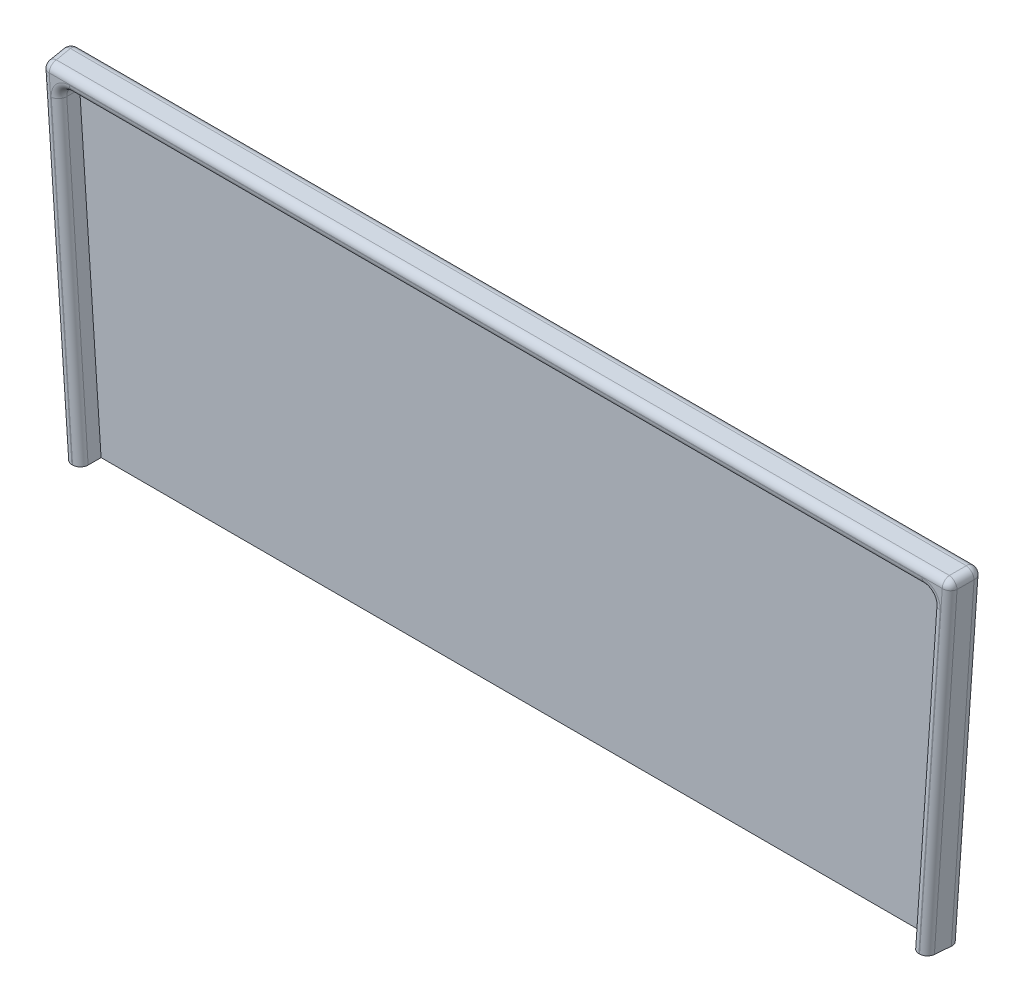
ISO-10303-21;
HEADER;
FILE_DESCRIPTION(('STEP AP214'),'2;1');
FILE_NAME('part.step','',(''),(''),'','','');
FILE_SCHEMA(('AUTOMOTIVE_DESIGN { 1 0 10303 214 1 1 1 1 }'));
ENDSEC;
DATA;
#1=APPLICATION_CONTEXT('core data for automotive mechanical design processes');
#2=APPLICATION_PROTOCOL_DEFINITION('international standard','automotive_design',2000,#1);
#3=PRODUCT_CONTEXT('',#1,'mechanical');
#4=PRODUCT('Part','Part','',(#3));
#5=PRODUCT_RELATED_PRODUCT_CATEGORY('part','',(#4));
#6=PRODUCT_DEFINITION_FORMATION('','',#4);
#7=PRODUCT_DEFINITION_CONTEXT('part definition',#1,'design');
#8=PRODUCT_DEFINITION('design','',#6,#7);
#9=PRODUCT_DEFINITION_SHAPE('','',#8);
#10=(LENGTH_UNIT() NAMED_UNIT(*) SI_UNIT(.MILLI.,.METRE.));
#11=(NAMED_UNIT(*) PLANE_ANGLE_UNIT() SI_UNIT($,.RADIAN.));
#12=(NAMED_UNIT(*) SI_UNIT($,.STERADIAN.) SOLID_ANGLE_UNIT());
#13=UNCERTAINTY_MEASURE_WITH_UNIT(LENGTH_MEASURE(1.E-05),#10,'distance_accuracy_value','');
#14=(GEOMETRIC_REPRESENTATION_CONTEXT(3) GLOBAL_UNCERTAINTY_ASSIGNED_CONTEXT((#13)) GLOBAL_UNIT_ASSIGNED_CONTEXT((#10,
#11,#12)) REPRESENTATION_CONTEXT('',''));
#15=CARTESIAN_POINT('',(0.,0.,0.));
#16=DIRECTION('',(0.,0.,1.));
#17=DIRECTION('',(1.,0.,0.));
#18=AXIS2_PLACEMENT_3D('',#15,#16,#17);
#19=CARTESIAN_POINT('',(-44.107162435431,32.6,0.));
#20=DIRECTION('',(0.,0.996194698091745,0.0871557427476584));
#21=DIRECTION('',(0.,-0.0871557427476584,0.996194698091746));
#22=AXIS2_PLACEMENT_3D('',#19,#20,#21);
#23=PLANE('',#22);
#24=DIRECTION('',(-0.092993495569234,-0.0867780721809915,0.991877903761529));
#25=VECTOR('',#24,1.);
#26=CARTESIAN_POINT('',(42.5505675232624,31.894589532194,8.06287854193786));
#27=LINE('',#26,#25);
#28=CARTESIAN_POINT('',(43.0894253857317,32.397431652478,2.31536680706074));
#29=VERTEX_POINT('',#28);
#30=CARTESIAN_POINT('',(43.2300578595723,32.5286646477669,0.815366807060742));
#31=VERTEX_POINT('',#30);
#32=EDGE_CURVE('E236',#29,#31,#27,.F.);
#33=ORIENTED_EDGE('',*,*,#32,.T.);
#34=DIRECTION('',(-1.,0.,0.));
#35=VECTOR('',#34,1.);
#36=CARTESIAN_POINT('',(-43.3065025603487,32.5286646477669,0.815366807060744));
#37=LINE('',#36,#35);
#38=CARTESIAN_POINT('',(-43.2300578595724,32.5286646477669,0.815366807060743));
#39=VERTEX_POINT('',#38);
#40=EDGE_CURVE('E71',#31,#39,#37,.T.);
#41=ORIENTED_EDGE('',*,*,#40,.T.);
#42=DIRECTION('',(0.0929934955692342,-0.0867780721809915,0.991877903761529));
#43=VECTOR('',#42,1.);
#44=CARTESIAN_POINT('',(-43.3134264989845,32.6064611620742,-0.0738514204444272));
#45=LINE('',#44,#43);
#46=CARTESIAN_POINT('',(-43.0894253857317,32.397431652478,2.31536680706074));
#47=VERTEX_POINT('',#46);
#48=EDGE_CURVE('E239',#39,#47,#45,.T.);
#49=ORIENTED_EDGE('',*,*,#48,.T.);
#50=DIRECTION('',(-1.,0.,0.));
#51=VECTOR('',#50,1.);
#52=CARTESIAN_POINT('',(-44.107162435431,32.397431652478,2.31536680706074));
#53=LINE('',#52,#51);
#54=EDGE_CURVE('E339',#47,#29,#53,.F.);
#55=ORIENTED_EDGE('',*,*,#54,.T.);
#56=EDGE_LOOP('',(#33,#41,#49,#55));
#57=FACE_BOUND('',#56,.T.);
#58=ADVANCED_FACE('F46',(#57),#23,.T.);
#59=CARTESIAN_POINT('',(-41.849761213049,-0.00690654551877314,0.));
#60=DIRECTION('',(-0.993815915145607,-0.0688026402793116,0.0871557427476584));
#61=DIRECTION('',(0.0873627671195146,0.,0.996176564129683));
#62=AXIS2_PLACEMENT_3D('',#59,#60,#61);
#63=PLANE('',#62);
#64=DIRECTION('',(0.0929934955692342,-0.0867780721809915,0.991877903761529));
#65=VECTOR('',#64,1.);
#66=CARTESIAN_POINT('',(-43.7761358102887,31.5439522387925,2.94094968490362));
#67=LINE('',#66,#65);
#68=CARTESIAN_POINT('',(-43.834787322091,31.5986836486997,2.31536680706074));
#69=VERTEX_POINT('',#68);
#70=CARTESIAN_POINT('',(-43.9754197959316,31.7299166439886,0.815366807060745));
#71=VERTEX_POINT('',#70);
#72=EDGE_CURVE('E233',#69,#71,#67,.F.);
#73=ORIENTED_EDGE('',*,*,#72,.T.);
#74=DIRECTION('',(0.069065455187732,-0.997612130489456,0.));
#75=VECTOR('',#74,1.);
#76=CARTESIAN_POINT('',(-41.7790743457874,0.00492680857295884,0.815366807060744));
#77=LINE('',#76,#75);
#78=CARTESIAN_POINT('',(-41.7787332590401,0.,0.815366807060743));
#79=VERTEX_POINT('',#78);
#80=EDGE_CURVE('E11',#71,#79,#77,.T.);
#81=ORIENTED_EDGE('',*,*,#80,.T.);
#82=DIRECTION('',(-0.0873627671195146,0.,-0.996176564129683));
#83=VECTOR('',#82,1.);
#84=CARTESIAN_POINT('',(-41.8502357091808,0.,4.16123973979527E-05));
#85=LINE('',#84,#83);
#86=CARTESIAN_POINT('',(-41.6471861464117,0.,2.31536680706074));
#87=VERTEX_POINT('',#86);
#88=EDGE_CURVE('E227',#79,#87,#85,.F.);
#89=ORIENTED_EDGE('',*,*,#88,.T.);
#90=DIRECTION('',(0.069065455187732,-0.997612130489456,0.));
#91=VECTOR('',#90,1.);
#92=CARTESIAN_POINT('',(-41.6476765723078,0.0070839296094626,2.31536680706074));
#93=LINE('',#92,#91);
#94=EDGE_CURVE('E346',#87,#69,#93,.F.);
#95=ORIENTED_EDGE('',*,*,#94,.T.);
#96=EDGE_LOOP('',(#73,#81,#89,#95));
#97=FACE_BOUND('',#96,.T.);
#98=ADVANCED_FACE('F412',(#97),#63,.T.);
#99=CARTESIAN_POINT('',(44.1071624354309,32.6,0.));
#100=DIRECTION('',(0.993815915145607,-0.0688026402793107,0.0871557427476584));
#101=DIRECTION('',(0.0873627671195146,0.,-0.996176564129683));
#102=AXIS2_PLACEMENT_3D('',#99,#100,#101);
#103=PLANE('',#102);
#104=DIRECTION('',(-0.0873627671195146,0.,0.996176564129683));
#105=VECTOR('',#104,1.);
#106=CARTESIAN_POINT('',(41.8674647666103,0.,-0.196417174329174));
#107=LINE('',#106,#105);
#108=CARTESIAN_POINT('',(41.6471861464117,0.,2.31536680706074));
#109=VERTEX_POINT('',#108);
#110=CARTESIAN_POINT('',(41.77873325904,0.,0.815366807060744));
#111=VERTEX_POINT('',#110);
#112=EDGE_CURVE('E223',#109,#111,#107,.F.);
#113=ORIENTED_EDGE('',*,*,#112,.T.);
#114=DIRECTION('',(0.069065455187731,0.997612130489456,0.));
#115=VECTOR('',#114,1.);
#116=CARTESIAN_POINT('',(43.9806994839873,31.8061788047947,0.815366807060743));
#117=LINE('',#116,#115);
#118=CARTESIAN_POINT('',(43.9754197959315,31.7299166439886,0.815366807060743));
#119=VERTEX_POINT('',#118);
#120=EDGE_CURVE('E349',#111,#119,#117,.T.);
#121=ORIENTED_EDGE('',*,*,#120,.T.);
#122=DIRECTION('',(-0.0929934955692341,-0.0867780721809915,0.991877903761529));
#123=VECTOR('',#122,1.);
#124=CARTESIAN_POINT('',(44.0587884353436,31.8077131582959,-0.0738514204444297));
#125=LINE('',#124,#123);
#126=CARTESIAN_POINT('',(43.8347873220908,31.5986836486997,2.31536680706075));
#127=VERTEX_POINT('',#126);
#128=EDGE_CURVE('E242',#119,#127,#125,.T.);
#129=ORIENTED_EDGE('',*,*,#128,.T.);
#130=DIRECTION('',(0.069065455187731,0.997612130489456,0.));
#131=VECTOR('',#130,1.);
#132=CARTESIAN_POINT('',(43.9050777946897,32.6139904751282,2.31536680706074));
#133=LINE('',#132,#131);
#134=EDGE_CURVE('E325',#127,#109,#133,.F.);
#135=ORIENTED_EDGE('',*,*,#134,.T.);
#136=EDGE_LOOP('',(#113,#121,#129,#135));
#137=FACE_BOUND('',#136,.T.);
#138=ADVANCED_FACE('F444',(#137),#103,.T.);
#139=CARTESIAN_POINT('',(0.,0.,3.));
#140=DIRECTION('',(0.,0.,-1.));
#141=DIRECTION('',(-1.,0.,0.));
#142=AXIS2_PLACEMENT_3D('',#139,#140,#141);
#143=PLANE('',#142);
#144=DIRECTION('',(1.,0.,0.));
#145=VECTOR('',#144,1.);
#146=CARTESIAN_POINT('',(0.,0.,3.));
#147=LINE('',#146,#145);
#148=CARTESIAN_POINT('',(40.8353499444417,0.,3.));
#149=VERTEX_POINT('',#148);
#150=CARTESIAN_POINT('',(40.8982517652687,0.,3.));
#151=VERTEX_POINT('',#150);
#152=EDGE_CURVE('E212',#149,#151,#147,.T.);
#153=ORIENTED_EDGE('',*,*,#152,.T.);
#154=DIRECTION('',(-0.069065455187731,-0.997612130489456,0.));
#155=VECTOR('',#154,1.);
#156=CARTESIAN_POINT('',(40.7031655870114,-2.81791146371615,3.));
#157=LINE('',#156,#155);
#158=CARTESIAN_POINT('',(43.0894253857317,31.6502856289092,3.));
#159=VERTEX_POINT('',#158);
#160=EDGE_CURVE('E321',#151,#159,#157,.F.);
#161=ORIENTED_EDGE('',*,*,#160,.T.);
#162=DIRECTION('',(1.,0.,0.));
#163=VECTOR('',#162,1.);
#164=CARTESIAN_POINT('',(0.,31.6502856289092,3.));
#165=LINE('',#164,#163);
#166=CARTESIAN_POINT('',(-43.0894253857317,31.6502856289092,3.));
#167=VERTEX_POINT('',#166);
#168=EDGE_CURVE('E318',#159,#167,#165,.F.);
#169=ORIENTED_EDGE('',*,*,#168,.T.);
#170=DIRECTION('',(-0.069065455187732,0.997612130489456,0.));
#171=VECTOR('',#170,1.);
#172=CARTESIAN_POINT('',(-40.7031655870115,-2.8179114637162,3.));
#173=LINE('',#172,#171);
#174=CARTESIAN_POINT('',(-40.8982517652688,0.,3.));
#175=VERTEX_POINT('',#174);
#176=EDGE_CURVE('E300',#167,#175,#173,.F.);
#177=ORIENTED_EDGE('',*,*,#176,.T.);
#178=CARTESIAN_POINT('',(-40.8353499444417,0.,3.));
#179=VERTEX_POINT('',#178);
#180=EDGE_CURVE('E217',#175,#179,#147,.T.);
#181=ORIENTED_EDGE('',*,*,#180,.T.);
#182=DIRECTION('',(0.0690654551877322,-0.997612130489456,0.));
#183=VECTOR('',#182,1.);
#184=CARTESIAN_POINT('',(-40.6405638102035,-2.81357749455257,3.));
#185=LINE('',#184,#183);
#186=CARTESIAN_POINT('',(-42.8926578303309,29.7166694628437,3.));
#187=VERTEX_POINT('',#186);
#188=EDGE_CURVE('E273',#179,#187,#185,.F.);
#189=ORIENTED_EDGE('',*,*,#188,.T.);
#190=CARTESIAN_POINT('',(-41.1468366019744,29.8375340094222,3.));
#191=DIRECTION('',(0.,0.,-1.));
#192=DIRECTION('',(-1.,0.,0.));
#193=AXIS2_PLACEMENT_3D('',#190,#191,#192);
#194=CIRCLE('',#193,1.75);
#195=CARTESIAN_POINT('',(-41.1468366019744,31.5875340094222,3.));
#196=VERTEX_POINT('',#195);
#197=EDGE_CURVE('E270',#187,#196,#194,.T.);
#198=ORIENTED_EDGE('',*,*,#197,.T.);
#199=DIRECTION('',(-1.,0.,0.));
#200=VECTOR('',#199,1.);
#201=CARTESIAN_POINT('',(0.,31.5875340094222,3.));
#202=LINE('',#201,#200);
#203=CARTESIAN_POINT('',(41.1468366019743,31.5875340094222,3.));
#204=VERTEX_POINT('',#203);
#205=EDGE_CURVE('E267',#196,#204,#202,.F.);
#206=ORIENTED_EDGE('',*,*,#205,.T.);
#207=CARTESIAN_POINT('',(41.1468366019743,29.8375340094222,3.));
#208=DIRECTION('',(0.,0.,-1.));
#209=DIRECTION('',(-1.,0.,0.));
#210=AXIS2_PLACEMENT_3D('',#207,#208,#209);
#211=CIRCLE('',#210,1.75);
#212=CARTESIAN_POINT('',(42.8926578303308,29.7166694628437,3.));
#213=VERTEX_POINT('',#212);
#214=EDGE_CURVE('E276',#204,#213,#211,.T.);
#215=ORIENTED_EDGE('',*,*,#214,.T.);
#216=DIRECTION('',(0.0690654551877313,0.997612130489456,0.));
#217=VECTOR('',#216,1.);
#218=CARTESIAN_POINT('',(40.6405638102034,-2.81357749455253,3.));
#219=LINE('',#218,#217);
#220=EDGE_CURVE('E279',#213,#149,#219,.F.);
#221=ORIENTED_EDGE('',*,*,#220,.T.);
#222=EDGE_LOOP('',(#153,#161,#169,#177,#181,#189,#198,#206,#215,#221));
#223=FACE_BOUND('',#222,.T.);
#224=ADVANCED_FACE('F458',(#223),#143,.F.);
#225=CARTESIAN_POINT('',(0.,0.,0.));
#226=DIRECTION('',(0.,0.,-1.));
#227=DIRECTION('',(-1.,0.,0.));
#228=AXIS2_PLACEMENT_3D('',#225,#226,#227);
#229=PLANE('',#228);
#230=DIRECTION('',(1.,0.,0.));
#231=VECTOR('',#230,1.);
#232=CARTESIAN_POINT('',(43.3065025603486,31.781518624198,0.));
#233=LINE('',#232,#231);
#234=CARTESIAN_POINT('',(-43.2300578595724,31.7815186241981,0.));
#235=VERTEX_POINT('',#234);
#236=CARTESIAN_POINT('',(43.2300578595723,31.781518624198,0.));
#237=VERTEX_POINT('',#236);
#238=EDGE_CURVE('E370',#235,#237,#233,.T.);
#239=ORIENTED_EDGE('',*,*,#238,.T.);
#240=DIRECTION('',(-0.069065455187731,-0.997612130489456,0.));
#241=VECTOR('',#240,1.);
#242=CARTESIAN_POINT('',(41.0337124094281,0.0565287887824284,0.));
#243=LINE('',#242,#241);
#244=CARTESIAN_POINT('',(41.029798877897,0.,0.));
#245=VERTEX_POINT('',#244);
#246=EDGE_CURVE('E373',#237,#245,#243,.T.);
#247=ORIENTED_EDGE('',*,*,#246,.T.);
#248=DIRECTION('',(1.,0.,0.));
#249=VECTOR('',#248,1.);
#250=CARTESIAN_POINT('',(0.,0.,0.));
#251=LINE('',#250,#249);
#252=CARTESIAN_POINT('',(-41.0297988778971,0.,0.));
#253=VERTEX_POINT('',#252);
#254=EDGE_CURVE('E230',#253,#245,#251,.T.);
#255=ORIENTED_EDGE('',*,*,#254,.F.);
#256=DIRECTION('',(-0.069065455187732,0.997612130489456,0.));
#257=VECTOR('',#256,1.);
#258=CARTESIAN_POINT('',(-43.2353375476282,31.8577807850042,0.));
#259=LINE('',#258,#257);
#260=EDGE_CURVE('E367',#253,#235,#259,.T.);
#261=ORIENTED_EDGE('',*,*,#260,.T.);
#262=EDGE_LOOP('',(#239,#247,#255,#261));
#263=FACE_BOUND('',#262,.T.);
#264=ADVANCED_FACE('F451',(#263),#229,.T.);
#265=CARTESIAN_POINT('',(0.,0.,0.));
#266=DIRECTION('',(0.,1.,0.));
#267=DIRECTION('',(0.,0.,1.));
#268=AXIS2_PLACEMENT_3D('',#265,#266,#267);
#269=PLANE('',#268);
#270=ORIENTED_EDGE('',*,*,#254,.T.);
#271=CARTESIAN_POINT('',(41.029798877897,0.,0.75));
#272=DIRECTION('',(0.,1.,0.));
#273=DIRECTION('',(1.,0.,0.));
#274=AXIS2_PLACEMENT_3D('',#271,#272,#273);
#275=ELLIPSE('',#274,0.751795188809532,0.75);
#276=EDGE_CURVE('E379',#245,#111,#275,.F.);
#277=ORIENTED_EDGE('',*,*,#276,.T.);
#278=ORIENTED_EDGE('',*,*,#112,.F.);
#279=CARTESIAN_POINT('',(40.8982517652687,0.,2.25));
#280=DIRECTION('',(0.,1.,0.));
#281=DIRECTION('',(-1.,0.,0.));
#282=AXIS2_PLACEMENT_3D('',#279,#280,#281);
#283=ELLIPSE('',#282,0.751795188809532,0.75);
#284=EDGE_CURVE('E332',#109,#151,#283,.F.);
#285=ORIENTED_EDGE('',*,*,#284,.T.);
#286=ORIENTED_EDGE('',*,*,#152,.F.);
#287=CARTESIAN_POINT('',(40.8353499444417,0.,2.25));
#288=DIRECTION('',(0.,1.,0.));
#289=DIRECTION('',(1.,0.,0.));
#290=AXIS2_PLACEMENT_3D('',#287,#288,#289);
#291=ELLIPSE('',#290,0.751795188809532,0.75);
#292=CARTESIAN_POINT('',(40.0835547556321,0.,2.25));
#293=VERTEX_POINT('',#292);
#294=EDGE_CURVE('E210',#149,#293,#291,.F.);
#295=ORIENTED_EDGE('',*,*,#294,.T.);
#296=DIRECTION('',(0.,0.,1.));
#297=VECTOR('',#296,1.);
#298=CARTESIAN_POINT('',(40.0835547556321,0.,1.));
#299=LINE('',#298,#297);
#300=CARTESIAN_POINT('',(40.0835547556321,0.,1.));
#301=VERTEX_POINT('',#300);
#302=EDGE_CURVE('E185',#301,#293,#299,.T.);
#303=ORIENTED_EDGE('',*,*,#302,.F.);
#304=DIRECTION('',(1.,0.,0.));
#305=VECTOR('',#304,1.);
#306=CARTESIAN_POINT('',(-40.0835547556322,0.,1.));
#307=LINE('',#306,#305);
#308=CARTESIAN_POINT('',(-40.0835547556322,0.,1.));
#309=VERTEX_POINT('',#308);
#310=EDGE_CURVE('E196',#309,#301,#307,.T.);
#311=ORIENTED_EDGE('',*,*,#310,.F.);
#312=DIRECTION('',(0.,0.,1.));
#313=VECTOR('',#312,1.);
#314=CARTESIAN_POINT('',(-40.0835547556322,0.,1.));
#315=LINE('',#314,#313);
#316=CARTESIAN_POINT('',(-40.0835547556322,0.,2.25));
#317=VERTEX_POINT('',#316);
#318=EDGE_CURVE('E204',#309,#317,#315,.T.);
#319=ORIENTED_EDGE('',*,*,#318,.T.);
#320=CARTESIAN_POINT('',(-40.8353499444417,0.,2.25));
#321=DIRECTION('',(0.,1.,0.));
#322=DIRECTION('',(1.,0.,0.));
#323=AXIS2_PLACEMENT_3D('',#320,#321,#322);
#324=ELLIPSE('',#323,0.751795188809532,0.75);
#325=EDGE_CURVE('E282',#317,#179,#324,.F.);
#326=ORIENTED_EDGE('',*,*,#325,.T.);
#327=ORIENTED_EDGE('',*,*,#180,.F.);
#328=CARTESIAN_POINT('',(-40.8982517652688,0.,2.25));
#329=DIRECTION('',(0.,1.,0.));
#330=DIRECTION('',(-1.,0.,0.));
#331=AXIS2_PLACEMENT_3D('',#328,#329,#330);
#332=ELLIPSE('',#331,0.751795188809532,0.75);
#333=EDGE_CURVE('E328',#175,#87,#332,.F.);
#334=ORIENTED_EDGE('',*,*,#333,.T.);
#335=ORIENTED_EDGE('',*,*,#88,.F.);
#336=CARTESIAN_POINT('',(-41.0297988778971,0.,0.75));
#337=DIRECTION('',(0.,1.,0.));
#338=DIRECTION('',(1.,0.,0.));
#339=AXIS2_PLACEMENT_3D('',#336,#337,#338);
#340=ELLIPSE('',#339,0.751795188809532,0.75);
#341=EDGE_CURVE('E376',#79,#253,#340,.F.);
#342=ORIENTED_EDGE('',*,*,#341,.T.);
#343=EDGE_LOOP('',(#270,#277,#278,#285,#286,#295,#303,#311,#319,#326,#327,#334,#335,#342));
#344=FACE_BOUND('',#343,.T.);
#345=ADVANCED_FACE('F207',(#344),#269,.F.);
#346=CARTESIAN_POINT('',(40.0835547556321,0.,1.));
#347=DIRECTION('',(0.997612130489456,-0.0690654551877313,0.));
#348=DIRECTION('',(0.0690654551877313,0.997612130489456,0.));
#349=AXIS2_PLACEMENT_3D('',#346,#347,#348);
#350=PLANE('',#349);
#351=ORIENTED_EDGE('',*,*,#302,.T.);
#352=DIRECTION('',(0.0690654551877313,0.997612130489456,0.));
#353=VECTOR('',#352,1.);
#354=CARTESIAN_POINT('',(40.0835547556321,0.,2.25));
#355=LINE('',#354,#353);
#356=CARTESIAN_POINT('',(42.1444487324637,29.7684685542345,2.25));
#357=VERTEX_POINT('',#356);
#358=EDGE_CURVE('E264',#293,#357,#355,.T.);
#359=ORIENTED_EDGE('',*,*,#358,.T.);
#360=DIRECTION('',(0.,0.,1.));
#361=VECTOR('',#360,1.);
#362=CARTESIAN_POINT('',(42.1444487324637,29.7684685542345,1.));
#363=LINE('',#362,#361);
#364=CARTESIAN_POINT('',(42.1444487324637,29.7684685542345,1.));
#365=VERTEX_POINT('',#364);
#366=EDGE_CURVE('E188',#357,#365,#363,.F.);
#367=ORIENTED_EDGE('',*,*,#366,.T.);
#368=DIRECTION('',(0.0690654551877313,0.997612130489456,0.));
#369=VECTOR('',#368,1.);
#370=CARTESIAN_POINT('',(40.0835547556321,0.,1.));
#371=LINE('',#370,#369);
#372=EDGE_CURVE('E180',#301,#365,#371,.T.);
#373=ORIENTED_EDGE('',*,*,#372,.F.);
#374=EDGE_LOOP('',(#351,#359,#367,#373));
#375=FACE_BOUND('',#374,.T.);
#376=ADVANCED_FACE('F182',(#375),#350,.F.);
#377=CARTESIAN_POINT('',(-42.2184609562845,30.8375340094222,1.));
#378=DIRECTION('',(-0.997612130489456,-0.0690654551877322,0.));
#379=DIRECTION('',(0.0690654551877322,-0.997612130489456,0.));
#380=AXIS2_PLACEMENT_3D('',#377,#378,#379);
#381=PLANE('',#380);
#382=DIRECTION('',(0.,0.,1.));
#383=VECTOR('',#382,1.);
#384=CARTESIAN_POINT('',(-42.1444487324639,29.7684685542345,3.));
#385=LINE('',#384,#383);
#386=CARTESIAN_POINT('',(-42.1444487324639,29.7684685542345,1.));
#387=VERTEX_POINT('',#386);
#388=CARTESIAN_POINT('',(-42.1444487324639,29.7684685542345,2.25));
#389=VERTEX_POINT('',#388);
#390=EDGE_CURVE('E260',#387,#389,#385,.T.);
#391=ORIENTED_EDGE('',*,*,#390,.T.);
#392=DIRECTION('',(0.0690654551877322,-0.997612130489456,0.));
#393=VECTOR('',#392,1.);
#394=CARTESIAN_POINT('',(-42.2184609562845,30.8375340094222,2.25));
#395=LINE('',#394,#393);
#396=EDGE_CURVE('E291',#389,#317,#395,.T.);
#397=ORIENTED_EDGE('',*,*,#396,.T.);
#398=ORIENTED_EDGE('',*,*,#318,.F.);
#399=DIRECTION('',(0.0690654551877322,-0.997612130489456,0.));
#400=VECTOR('',#399,1.);
#401=CARTESIAN_POINT('',(-42.2184609562845,30.8375340094222,1.));
#402=LINE('',#401,#400);
#403=EDGE_CURVE('E199',#387,#309,#402,.T.);
#404=ORIENTED_EDGE('',*,*,#403,.F.);
#405=EDGE_LOOP('',(#391,#397,#398,#404));
#406=FACE_BOUND('',#405,.T.);
#407=ADVANCED_FACE('F497',(#406),#381,.F.);
#408=CARTESIAN_POINT('',(42.2184609562844,30.8375340094222,1.));
#409=DIRECTION('',(0.,1.,0.));
#410=DIRECTION('',(0.,0.,1.));
#411=AXIS2_PLACEMENT_3D('',#408,#409,#410);
#412=PLANE('',#411);
#413=DIRECTION('',(0.,0.,1.));
#414=VECTOR('',#413,1.);
#415=CARTESIAN_POINT('',(41.1468366019743,30.8375340094222,3.));
#416=LINE('',#415,#414);
#417=CARTESIAN_POINT('',(41.1468366019743,30.8375340094222,1.));
#418=VERTEX_POINT('',#417);
#419=CARTESIAN_POINT('',(41.1468366019743,30.8375340094222,2.25));
#420=VERTEX_POINT('',#419);
#421=EDGE_CURVE('E248',#418,#420,#416,.T.);
#422=ORIENTED_EDGE('',*,*,#421,.T.);
#423=DIRECTION('',(-1.,0.,0.));
#424=VECTOR('',#423,1.);
#425=CARTESIAN_POINT('',(42.2184609562844,30.8375340094222,2.25));
#426=LINE('',#425,#424);
#427=CARTESIAN_POINT('',(-41.1468366019744,30.8375340094222,2.25));
#428=VERTEX_POINT('',#427);
#429=EDGE_CURVE('E297',#420,#428,#426,.T.);
#430=ORIENTED_EDGE('',*,*,#429,.T.);
#431=DIRECTION('',(0.,0.,1.));
#432=VECTOR('',#431,1.);
#433=CARTESIAN_POINT('',(-41.1468366019744,30.8375340094222,1.));
#434=LINE('',#433,#432);
#435=CARTESIAN_POINT('',(-41.1468366019744,30.8375340094222,1.));
#436=VERTEX_POINT('',#435);
#437=EDGE_CURVE('E245',#428,#436,#434,.F.);
#438=ORIENTED_EDGE('',*,*,#437,.T.);
#439=DIRECTION('',(-1.,0.,0.));
#440=VECTOR('',#439,1.);
#441=CARTESIAN_POINT('',(42.2184609562844,30.8375340094222,1.));
#442=LINE('',#441,#440);
#443=EDGE_CURVE('E192',#418,#436,#442,.T.);
#444=ORIENTED_EDGE('',*,*,#443,.F.);
#445=EDGE_LOOP('',(#422,#430,#438,#444));
#446=FACE_BOUND('',#445,.T.);
#447=ADVANCED_FACE('F471',(#446),#412,.F.);
#448=CARTESIAN_POINT('',(0.,0.,1.));
#449=DIRECTION('',(0.,0.,1.));
#450=DIRECTION('',(1.,0.,0.));
#451=AXIS2_PLACEMENT_3D('',#448,#449,#450);
#452=PLANE('',#451);
#453=ORIENTED_EDGE('',*,*,#372,.T.);
#454=CARTESIAN_POINT('',(41.1468366019743,29.8375340094222,1.));
#455=DIRECTION('',(0.,0.,1.));
#456=DIRECTION('',(1.,0.,0.));
#457=AXIS2_PLACEMENT_3D('',#454,#455,#456);
#458=CIRCLE('',#457,1.);
#459=EDGE_CURVE('E257',#365,#418,#458,.T.);
#460=ORIENTED_EDGE('',*,*,#459,.T.);
#461=ORIENTED_EDGE('',*,*,#443,.T.);
#462=CARTESIAN_POINT('',(-41.1468366019744,29.8375340094222,1.));
#463=DIRECTION('',(0.,0.,1.));
#464=DIRECTION('',(1.,0.,0.));
#465=AXIS2_PLACEMENT_3D('',#462,#463,#464);
#466=CIRCLE('',#465,1.);
#467=EDGE_CURVE('E254',#436,#387,#466,.T.);
#468=ORIENTED_EDGE('',*,*,#467,.T.);
#469=ORIENTED_EDGE('',*,*,#403,.T.);
#470=ORIENTED_EDGE('',*,*,#310,.T.);
#471=EDGE_LOOP('',(#453,#460,#461,#468,#469,#470));
#472=FACE_BOUND('',#471,.T.);
#473=ADVANCED_FACE('F197',(#472),#452,.T.);
#474=CARTESIAN_POINT('',(-43.0307738739295,31.595554219002,2.87558287784288));
#475=DIRECTION('',(-0.0929934955692342,0.0867780721809915,-0.991877903761529));
#476=DIRECTION('',(-0.995633765023603,0.,0.0933456262763592));
#477=AXIS2_PLACEMENT_3D('',#474,#475,#476);
#478=CYLINDRICAL_SURFACE('',#477,0.75);
#479=ORIENTED_EDGE('',*,*,#48,.F.);
#480=CARTESIAN_POINT('',(-43.2300578595724,31.7815186241981,0.75));
#481=DIRECTION('',(-0.0929934955692342,0.0867780721809915,-0.991877903761529));
#482=DIRECTION('',(-0.995633765023603,0.,0.0933456262763592));
#483=AXIS2_PLACEMENT_3D('',#480,#481,#482);
#484=CIRCLE('',#483,0.75);
#485=EDGE_CURVE('E56',#39,#71,#484,.F.);
#486=ORIENTED_EDGE('',*,*,#485,.T.);
#487=ORIENTED_EDGE('',*,*,#72,.F.);
#488=CARTESIAN_POINT('',(-43.0894253857317,31.6502856289092,2.25));
#489=DIRECTION('',(-0.0929934955692342,0.0867780721809915,-0.991877903761529));
#490=DIRECTION('',(-0.995633765023603,0.,0.0933456262763592));
#491=AXIS2_PLACEMENT_3D('',#488,#489,#490);
#492=CIRCLE('',#491,0.75);
#493=EDGE_CURVE('E342',#69,#47,#492,.T.);
#494=ORIENTED_EDGE('',*,*,#493,.T.);
#495=EDGE_LOOP('',(#479,#486,#487,#494));
#496=FACE_BOUND('',#495,.T.);
#497=ADVANCED_FACE('F422',(#496),#478,.T.);
#498=CARTESIAN_POINT('',(42.5505675232624,31.1474435086252,7.99751173487712));
#499=DIRECTION('',(0.092993495569234,0.0867780721809914,-0.991877903761529));
#500=DIRECTION('',(-0.995633765023603,0.,-0.0933456262763591));
#501=AXIS2_PLACEMENT_3D('',#498,#499,#500);
#502=CYLINDRICAL_SURFACE('',#501,0.75);
#503=ORIENTED_EDGE('',*,*,#128,.F.);
#504=CARTESIAN_POINT('',(43.2300578595723,31.781518624198,0.749999999999999));
#505=DIRECTION('',(0.092993495569234,0.0867780721809914,-0.991877903761529));
#506=DIRECTION('',(-0.995633765023603,0.,-0.0933456262763591));
#507=AXIS2_PLACEMENT_3D('',#504,#505,#506);
#508=CIRCLE('',#507,0.75);
#509=EDGE_CURVE('E382',#119,#31,#508,.F.);
#510=ORIENTED_EDGE('',*,*,#509,.T.);
#511=ORIENTED_EDGE('',*,*,#32,.F.);
#512=CARTESIAN_POINT('',(43.0894253857317,31.6502856289092,2.25));
#513=DIRECTION('',(0.092993495569234,0.0867780721809914,-0.991877903761529));
#514=DIRECTION('',(-0.995633765023603,0.,-0.0933456262763591));
#515=AXIS2_PLACEMENT_3D('',#512,#513,#514);
#516=CIRCLE('',#515,0.75);
#517=EDGE_CURVE('E335',#29,#127,#516,.T.);
#518=ORIENTED_EDGE('',*,*,#517,.T.);
#519=EDGE_LOOP('',(#503,#510,#511,#518));
#520=FACE_BOUND('',#519,.T.);
#521=ADVANCED_FACE('F435',(#520),#502,.T.);
#522=CARTESIAN_POINT('',(41.1468366019743,29.8375340094222,1.));
#523=DIRECTION('',(0.,0.,-1.));
#524=DIRECTION('',(-1.,0.,0.));
#525=AXIS2_PLACEMENT_3D('',#522,#523,#524);
#526=CYLINDRICAL_SURFACE('',#525,1.);
#527=ORIENTED_EDGE('',*,*,#366,.F.);
#528=CARTESIAN_POINT('',(41.1468366019743,29.8375340094222,2.25));
#529=DIRECTION('',(0.,0.,-1.));
#530=DIRECTION('',(-1.,0.,0.));
#531=AXIS2_PLACEMENT_3D('',#528,#529,#530);
#532=CIRCLE('',#531,1.);
#533=EDGE_CURVE('E288',#357,#420,#532,.F.);
#534=ORIENTED_EDGE('',*,*,#533,.T.);
#535=ORIENTED_EDGE('',*,*,#421,.F.);
#536=ORIENTED_EDGE('',*,*,#459,.F.);
#537=EDGE_LOOP('',(#527,#534,#535,#536));
#538=FACE_BOUND('',#537,.T.);
#539=ADVANCED_FACE('F465',(#538),#526,.F.);
#540=CARTESIAN_POINT('',(-41.1468366019744,29.8375340094222,1.));
#541=DIRECTION('',(0.,0.,-1.));
#542=DIRECTION('',(-1.,0.,0.));
#543=AXIS2_PLACEMENT_3D('',#540,#541,#542);
#544=CYLINDRICAL_SURFACE('',#543,1.);
#545=ORIENTED_EDGE('',*,*,#437,.F.);
#546=CARTESIAN_POINT('',(-41.1468366019744,29.8375340094222,2.25));
#547=DIRECTION('',(0.,0.,-1.));
#548=DIRECTION('',(-1.,0.,0.));
#549=AXIS2_PLACEMENT_3D('',#546,#547,#548);
#550=CIRCLE('',#549,1.);
#551=EDGE_CURVE('E294',#428,#389,#550,.F.);
#552=ORIENTED_EDGE('',*,*,#551,.T.);
#553=ORIENTED_EDGE('',*,*,#390,.F.);
#554=ORIENTED_EDGE('',*,*,#467,.F.);
#555=EDGE_LOOP('',(#545,#552,#553,#554));
#556=FACE_BOUND('',#555,.T.);
#557=ADVANCED_FACE('F479',(#556),#544,.F.);
#558=CARTESIAN_POINT('',(-42.9666700541516,30.7857349180314,2.25));
#559=DIRECTION('',(0.0690654551877322,-0.997612130489456,0.));
#560=DIRECTION('',(0.997612130489456,0.0690654551877322,0.));
#561=AXIS2_PLACEMENT_3D('',#558,#559,#560);
#562=CYLINDRICAL_SURFACE('',#561,0.75);
#563=ORIENTED_EDGE('',*,*,#325,.F.);
#564=ORIENTED_EDGE('',*,*,#396,.F.);
#565=CARTESIAN_POINT('',(-42.8926578303309,29.7166694628437,2.25));
#566=DIRECTION('',(-0.0690654551877328,0.997612130489456,0.));
#567=DIRECTION('',(-0.997612130489456,-0.0690654551877328,0.));
#568=AXIS2_PLACEMENT_3D('',#565,#566,#567);
#569=CIRCLE('',#568,0.75);
#570=EDGE_CURVE('E193',#187,#389,#569,.T.);
#571=ORIENTED_EDGE('',*,*,#570,.F.);
#572=ORIENTED_EDGE('',*,*,#188,.F.);
#573=EDGE_LOOP('',(#563,#564,#571,#572));
#574=FACE_BOUND('',#573,.T.);
#575=ADVANCED_FACE('F495',(#574),#562,.T.);
#576=CARTESIAN_POINT('',(-41.1468366019744,29.8375340094222,2.25));
#577=DIRECTION('',(0.,0.,-1.));
#578=DIRECTION('',(-1.,0.,0.));
#579=AXIS2_PLACEMENT_3D('',#576,#577,#578);
#580=TOROIDAL_SURFACE('',#579,1.75,0.75);
#581=ORIENTED_EDGE('',*,*,#570,.T.);
#582=ORIENTED_EDGE('',*,*,#551,.F.);
#583=CARTESIAN_POINT('',(-41.1468366019744,31.5875340094222,2.25));
#584=DIRECTION('',(1.,0.,0.));
#585=DIRECTION('',(0.,0.,-1.));
#586=AXIS2_PLACEMENT_3D('',#583,#584,#585);
#587=CIRCLE('',#586,0.75);
#588=EDGE_CURVE('E309',#196,#428,#587,.T.);
#589=ORIENTED_EDGE('',*,*,#588,.F.);
#590=ORIENTED_EDGE('',*,*,#197,.F.);
#591=EDGE_LOOP('',(#581,#582,#589,#590));
#592=FACE_BOUND('',#591,.T.);
#593=ADVANCED_FACE('F483',(#592),#580,.T.);
#594=CARTESIAN_POINT('',(42.2184609562844,31.5875340094222,2.25));
#595=DIRECTION('',(-1.,0.,0.));
#596=DIRECTION('',(0.,0.,1.));
#597=AXIS2_PLACEMENT_3D('',#594,#595,#596);
#598=CYLINDRICAL_SURFACE('',#597,0.75);
#599=ORIENTED_EDGE('',*,*,#588,.T.);
#600=ORIENTED_EDGE('',*,*,#429,.F.);
#601=CARTESIAN_POINT('',(41.1468366019743,31.5875340094222,2.25));
#602=DIRECTION('',(1.,0.,0.));
#603=DIRECTION('',(0.,0.,-1.));
#604=AXIS2_PLACEMENT_3D('',#601,#602,#603);
#605=CIRCLE('',#604,0.75);
#606=EDGE_CURVE('E304',#204,#420,#605,.T.);
#607=ORIENTED_EDGE('',*,*,#606,.F.);
#608=ORIENTED_EDGE('',*,*,#205,.F.);
#609=EDGE_LOOP('',(#599,#600,#607,#608));
#610=FACE_BOUND('',#609,.T.);
#611=ADVANCED_FACE('F488',(#610),#598,.T.);
#612=CARTESIAN_POINT('',(41.1468366019743,29.8375340094222,2.25));
#613=DIRECTION('',(0.,0.,-1.));
#614=DIRECTION('',(-1.,0.,0.));
#615=AXIS2_PLACEMENT_3D('',#612,#613,#614);
#616=TOROIDAL_SURFACE('',#615,1.75,0.75);
#617=ORIENTED_EDGE('',*,*,#606,.T.);
#618=ORIENTED_EDGE('',*,*,#533,.F.);
#619=CARTESIAN_POINT('',(42.8926578303308,29.7166694628437,2.25));
#620=DIRECTION('',(-0.0690654551877321,-0.997612130489456,0.));
#621=DIRECTION('',(0.997612130489456,-0.0690654551877321,0.));
#622=AXIS2_PLACEMENT_3D('',#619,#620,#621);
#623=CIRCLE('',#622,0.75);
#624=EDGE_CURVE('E301',#213,#357,#623,.T.);
#625=ORIENTED_EDGE('',*,*,#624,.F.);
#626=ORIENTED_EDGE('',*,*,#214,.F.);
#627=EDGE_LOOP('',(#617,#618,#625,#626));
#628=FACE_BOUND('',#627,.T.);
#629=ADVANCED_FACE('F528',(#628),#616,.T.);
#630=CARTESIAN_POINT('',(40.8317638534992,-0.0517990913907985,2.25));
#631=DIRECTION('',(0.0690654551877313,0.997612130489456,0.));
#632=DIRECTION('',(-0.997612130489456,0.0690654551877313,0.));
#633=AXIS2_PLACEMENT_3D('',#630,#631,#632);
#634=CYLINDRICAL_SURFACE('',#633,0.75);
#635=ORIENTED_EDGE('',*,*,#294,.F.);
#636=ORIENTED_EDGE('',*,*,#220,.F.);
#637=ORIENTED_EDGE('',*,*,#624,.T.);
#638=ORIENTED_EDGE('',*,*,#358,.F.);
#639=EDGE_LOOP('',(#635,#636,#637,#638));
#640=FACE_BOUND('',#639,.T.);
#641=ADVANCED_FACE('F461',(#640),#634,.T.);
#642=CARTESIAN_POINT('',(-40.7031655870115,-2.8179114637162,2.25));
#643=DIRECTION('',(-0.069065455187732,0.997612130489456,0.));
#644=DIRECTION('',(-0.997612130489456,-0.069065455187732,0.));
#645=AXIS2_PLACEMENT_3D('',#642,#643,#644);
#646=CYLINDRICAL_SURFACE('',#645,0.75);
#647=CARTESIAN_POINT('',(-43.0894253857317,31.6502856289092,2.25));
#648=DIRECTION('',(-0.069065455187728,0.997612130489456,0.));
#649=DIRECTION('',(-0.997612130489456,-0.069065455187728,0.));
#650=AXIS2_PLACEMENT_3D('',#647,#648,#649);
#651=CIRCLE('',#650,0.75);
#652=EDGE_CURVE('E305',#69,#167,#651,.T.);
#653=ORIENTED_EDGE('',*,*,#652,.F.);
#654=ORIENTED_EDGE('',*,*,#94,.F.);
#655=ORIENTED_EDGE('',*,*,#333,.F.);
#656=ORIENTED_EDGE('',*,*,#176,.F.);
#657=EDGE_LOOP('',(#653,#654,#655,#656));
#658=FACE_BOUND('',#657,.T.);
#659=ADVANCED_FACE('F420',(#658),#646,.T.);
#660=CARTESIAN_POINT('',(-43.0894253857317,31.6502856289092,2.25));
#661=DIRECTION('',(0.,0.,-1.));
#662=DIRECTION('',(-1.,0.,0.));
#663=AXIS2_PLACEMENT_3D('',#660,#661,#662);
#664=SPHERICAL_SURFACE('',#663,0.75);
#665=ORIENTED_EDGE('',*,*,#493,.F.);
#666=ORIENTED_EDGE('',*,*,#652,.T.);
#667=CARTESIAN_POINT('',(-43.0894253857317,31.6502856289092,2.25));
#668=DIRECTION('',(1.,0.,0.));
#669=DIRECTION('',(0.,0.,-1.));
#670=AXIS2_PLACEMENT_3D('',#667,#668,#669);
#671=CIRCLE('',#670,0.75);
#672=EDGE_CURVE('E357',#47,#167,#671,.T.);
#673=ORIENTED_EDGE('',*,*,#672,.F.);
#674=EDGE_LOOP('',(#665,#666,#673));
#675=FACE_BOUND('',#674,.T.);
#676=ADVANCED_FACE('F426',(#675),#664,.T.);
#677=CARTESIAN_POINT('',(0.,31.6502856289092,2.25));
#678=DIRECTION('',(1.,0.,0.));
#679=DIRECTION('',(0.,0.,-1.));
#680=AXIS2_PLACEMENT_3D('',#677,#678,#679);
#681=CYLINDRICAL_SURFACE('',#680,0.75);
#682=CARTESIAN_POINT('',(43.0894253857317,31.6502856289092,2.25));
#683=DIRECTION('',(1.,0.,0.));
#684=DIRECTION('',(0.,0.,-1.));
#685=AXIS2_PLACEMENT_3D('',#682,#683,#684);
#686=CIRCLE('',#685,0.75);
#687=EDGE_CURVE('E353',#29,#159,#686,.T.);
#688=ORIENTED_EDGE('',*,*,#687,.F.);
#689=ORIENTED_EDGE('',*,*,#54,.F.);
#690=ORIENTED_EDGE('',*,*,#672,.T.);
#691=ORIENTED_EDGE('',*,*,#168,.F.);
#692=EDGE_LOOP('',(#688,#689,#690,#691));
#693=FACE_BOUND('',#692,.T.);
#694=ADVANCED_FACE('F430',(#693),#681,.T.);
#695=CARTESIAN_POINT('',(43.0894253857317,31.6502856289092,2.25));
#696=DIRECTION('',(0.,0.,-1.));
#697=DIRECTION('',(-1.,0.,0.));
#698=AXIS2_PLACEMENT_3D('',#695,#696,#697);
#699=SPHERICAL_SURFACE('',#698,0.75);
#700=ORIENTED_EDGE('',*,*,#517,.F.);
#701=ORIENTED_EDGE('',*,*,#687,.T.);
#702=CARTESIAN_POINT('',(43.0894253857317,31.6502856289092,2.25));
#703=DIRECTION('',(-0.0690654551877196,-0.997612130489457,0.));
#704=DIRECTION('',(0.997612130489457,-0.0690654551877196,0.));
#705=AXIS2_PLACEMENT_3D('',#702,#703,#704);
#706=CIRCLE('',#705,0.75);
#707=EDGE_CURVE('E350',#127,#159,#706,.T.);
#708=ORIENTED_EDGE('',*,*,#707,.F.);
#709=EDGE_LOOP('',(#700,#701,#708));
#710=FACE_BOUND('',#709,.T.);
#711=ADVANCED_FACE('F540',(#710),#699,.T.);
#712=CARTESIAN_POINT('',(40.7031655870114,-2.81791146371615,2.25));
#713=DIRECTION('',(-0.069065455187731,-0.997612130489456,0.));
#714=DIRECTION('',(0.997612130489456,-0.069065455187731,0.));
#715=AXIS2_PLACEMENT_3D('',#712,#713,#714);
#716=CYLINDRICAL_SURFACE('',#715,0.75);
#717=ORIENTED_EDGE('',*,*,#284,.F.);
#718=ORIENTED_EDGE('',*,*,#134,.F.);
#719=ORIENTED_EDGE('',*,*,#707,.T.);
#720=ORIENTED_EDGE('',*,*,#160,.F.);
#721=EDGE_LOOP('',(#717,#718,#719,#720));
#722=FACE_BOUND('',#721,.T.);
#723=ADVANCED_FACE('F455',(#722),#716,.T.);
#724=CARTESIAN_POINT('',(-41.0332342639692,0.0496222432636699,0.75));
#725=DIRECTION('',(0.069065455187732,-0.997612130489456,0.));
#726=DIRECTION('',(0.997612130489456,0.069065455187732,0.));
#727=AXIS2_PLACEMENT_3D('',#724,#725,#726);
#728=CYLINDRICAL_SURFACE('',#727,0.75);
#729=ORIENTED_EDGE('',*,*,#341,.F.);
#730=ORIENTED_EDGE('',*,*,#80,.F.);
#731=CARTESIAN_POINT('',(-43.2300578595724,31.7815186241981,0.75));
#732=DIRECTION('',(-0.0690654551877189,0.997612130489457,0.));
#733=DIRECTION('',(-0.997612130489457,-0.0690654551877189,0.));
#734=AXIS2_PLACEMENT_3D('',#731,#732,#733);
#735=CIRCLE('',#734,0.75);
#736=EDGE_CURVE('E50',#235,#71,#735,.T.);
#737=ORIENTED_EDGE('',*,*,#736,.F.);
#738=ORIENTED_EDGE('',*,*,#260,.F.);
#739=EDGE_LOOP('',(#729,#730,#737,#738));
#740=FACE_BOUND('',#739,.T.);
#741=ADVANCED_FACE('F48',(#740),#728,.T.);
#742=CARTESIAN_POINT('',(-43.2300578595724,31.7815186241981,0.75));
#743=DIRECTION('',(0.,0.,-1.));
#744=DIRECTION('',(-1.,0.,0.));
#745=AXIS2_PLACEMENT_3D('',#742,#743,#744);
#746=SPHERICAL_SURFACE('',#745,0.75);
#747=ORIENTED_EDGE('',*,*,#736,.T.);
#748=ORIENTED_EDGE('',*,*,#485,.F.);
#749=CARTESIAN_POINT('',(-43.2300578595724,31.7815186241981,0.75));
#750=DIRECTION('',(1.,0.,0.));
#751=DIRECTION('',(0.,1.,0.));
#752=AXIS2_PLACEMENT_3D('',#749,#750,#751);
#753=CIRCLE('',#752,0.75);
#754=EDGE_CURVE('E395',#235,#39,#753,.T.);
#755=ORIENTED_EDGE('',*,*,#754,.F.);
#756=EDGE_LOOP('',(#747,#748,#755));
#757=FACE_BOUND('',#756,.T.);
#758=ADVANCED_FACE('F405',(#757),#746,.T.);
#759=CARTESIAN_POINT('',(-44.107162435431,31.781518624198,0.75));
#760=DIRECTION('',(-1.,0.,0.));
#761=DIRECTION('',(0.,0.,1.));
#762=AXIS2_PLACEMENT_3D('',#759,#760,#761);
#763=CYLINDRICAL_SURFACE('',#762,0.75);
#764=ORIENTED_EDGE('',*,*,#754,.T.);
#765=ORIENTED_EDGE('',*,*,#40,.F.);
#766=CARTESIAN_POINT('',(43.2300578595723,31.781518624198,0.75));
#767=DIRECTION('',(1.,0.,0.));
#768=DIRECTION('',(0.,1.,0.));
#769=AXIS2_PLACEMENT_3D('',#766,#767,#768);
#770=CIRCLE('',#769,0.75);
#771=EDGE_CURVE('E392',#237,#31,#770,.T.);
#772=ORIENTED_EDGE('',*,*,#771,.F.);
#773=ORIENTED_EDGE('',*,*,#238,.F.);
#774=EDGE_LOOP('',(#764,#765,#772,#773));
#775=FACE_BOUND('',#774,.T.);
#776=ADVANCED_FACE('F554',(#775),#763,.T.);
#777=CARTESIAN_POINT('',(43.2300578595723,31.781518624198,0.75));
#778=DIRECTION('',(0.,0.,-1.));
#779=DIRECTION('',(-1.,0.,0.));
#780=AXIS2_PLACEMENT_3D('',#777,#778,#779);
#781=SPHERICAL_SURFACE('',#780,0.75);
#782=ORIENTED_EDGE('',*,*,#771,.T.);
#783=ORIENTED_EDGE('',*,*,#509,.F.);
#784=CARTESIAN_POINT('',(43.2300578595723,31.781518624198,0.75));
#785=DIRECTION('',(-0.0690654551877195,-0.997612130489457,0.));
#786=DIRECTION('',(0.997612130489457,-0.0690654551877195,0.));
#787=AXIS2_PLACEMENT_3D('',#784,#785,#786);
#788=CIRCLE('',#787,0.75);
#789=EDGE_CURVE('E389',#237,#119,#788,.T.);
#790=ORIENTED_EDGE('',*,*,#789,.F.);
#791=EDGE_LOOP('',(#782,#783,#790));
#792=FACE_BOUND('',#791,.T.);
#793=ADVANCED_FACE('F440',(#792),#781,.T.);
#794=CARTESIAN_POINT('',(43.2906354863512,32.6565287887824,0.75));
#795=DIRECTION('',(0.069065455187731,0.997612130489456,0.));
#796=DIRECTION('',(-0.997612130489456,0.069065455187731,0.));
#797=AXIS2_PLACEMENT_3D('',#794,#795,#796);
#798=CYLINDRICAL_SURFACE('',#797,0.75);
#799=ORIENTED_EDGE('',*,*,#276,.F.);
#800=ORIENTED_EDGE('',*,*,#246,.F.);
#801=ORIENTED_EDGE('',*,*,#789,.T.);
#802=ORIENTED_EDGE('',*,*,#120,.F.);
#803=EDGE_LOOP('',(#799,#800,#801,#802));
#804=FACE_BOUND('',#803,.T.);
#805=ADVANCED_FACE('F448',(#804),#798,.T.);
#806=CLOSED_SHELL('',(#58,#98,#138,#224,#264,#345,#376,#407,#447,#473,#497,#521,#539,#557,#575,
#593,#611,#629,#641,#659,#676,#694,#711,#723,#741,#758,#776,#793,#805));
#807=MANIFOLD_SOLID_BREP('B2',#806);
#808=ADVANCED_BREP_SHAPE_REPRESENTATION('',(#18,#807),#14);
#809=SHAPE_DEFINITION_REPRESENTATION(#9,#808);
ENDSEC;
END-ISO-10303-21;
